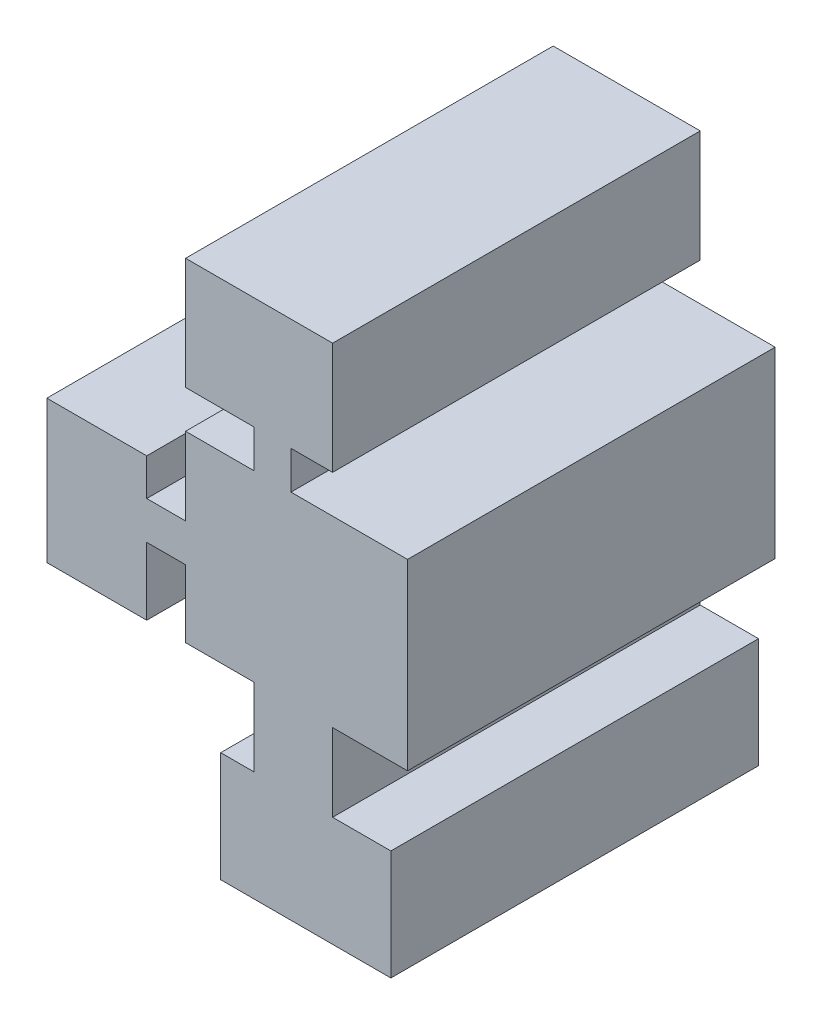
ISO-10303-21;
HEADER;
FILE_DESCRIPTION(('STEP AP214'),'2;1');
FILE_NAME('part.step','',(''),(''),'','','');
FILE_SCHEMA(('AUTOMOTIVE_DESIGN { 1 0 10303 214 1 1 1 1 }'));
ENDSEC;
DATA;
#1=APPLICATION_CONTEXT('core data for automotive mechanical design processes');
#2=APPLICATION_PROTOCOL_DEFINITION('international standard','automotive_design',2000,#1);
#3=PRODUCT_CONTEXT('',#1,'mechanical');
#4=PRODUCT('Part','Part','',(#3));
#5=PRODUCT_RELATED_PRODUCT_CATEGORY('part','',(#4));
#6=PRODUCT_DEFINITION_FORMATION('','',#4);
#7=PRODUCT_DEFINITION_CONTEXT('part definition',#1,'design');
#8=PRODUCT_DEFINITION('design','',#6,#7);
#9=PRODUCT_DEFINITION_SHAPE('','',#8);
#10=(LENGTH_UNIT() NAMED_UNIT(*) SI_UNIT(.MILLI.,.METRE.));
#11=(NAMED_UNIT(*) PLANE_ANGLE_UNIT() SI_UNIT($,.RADIAN.));
#12=(NAMED_UNIT(*) SI_UNIT($,.STERADIAN.) SOLID_ANGLE_UNIT());
#13=UNCERTAINTY_MEASURE_WITH_UNIT(LENGTH_MEASURE(1.E-05),#10,'distance_accuracy_value','');
#14=(GEOMETRIC_REPRESENTATION_CONTEXT(3) GLOBAL_UNCERTAINTY_ASSIGNED_CONTEXT((#13)) GLOBAL_UNIT_ASSIGNED_CONTEXT((#10,
#11,#12)) REPRESENTATION_CONTEXT('',''));
#15=CARTESIAN_POINT('',(0.,0.,0.));
#16=DIRECTION('',(0.,0.,1.));
#17=DIRECTION('',(1.,0.,0.));
#18=AXIS2_PLACEMENT_3D('',#15,#16,#17);
#19=CARTESIAN_POINT('',(539.921047334545,88.9758944559464,10.));
#20=DIRECTION('',(0.,-1.,0.));
#21=DIRECTION('',(0.,0.,-1.));
#22=AXIS2_PLACEMENT_3D('',#19,#20,#21);
#23=PLANE('',#22);
#24=DIRECTION('',(-1.,0.,0.));
#25=VECTOR('',#24,1.);
#26=CARTESIAN_POINT('',(539.921047334545,88.9758944559464,0.));
#27=LINE('',#26,#25);
#28=CARTESIAN_POINT('',(543.0906331024,88.9758944559464,0.));
#29=VERTEX_POINT('',#28);
#30=CARTESIAN_POINT('',(539.921047334545,88.9758944559464,0.));
#31=VERTEX_POINT('',#30);
#32=EDGE_CURVE('E266',#29,#31,#27,.T.);
#33=ORIENTED_EDGE('',*,*,#32,.T.);
#34=DIRECTION('',(0.,0.,-1.));
#35=VECTOR('',#34,1.);
#36=CARTESIAN_POINT('',(539.921047334545,88.9758944559464,10.));
#37=LINE('',#36,#35);
#38=CARTESIAN_POINT('',(539.921047334545,88.9758944559464,10.));
#39=VERTEX_POINT('',#38);
#40=EDGE_CURVE('E11',#39,#31,#37,.T.);
#41=ORIENTED_EDGE('',*,*,#40,.F.);
#42=DIRECTION('',(-1.,0.,0.));
#43=VECTOR('',#42,1.);
#44=CARTESIAN_POINT('',(539.921047334545,88.9758944559464,10.));
#45=LINE('',#44,#43);
#46=CARTESIAN_POINT('',(543.0906331024,88.9758944559464,10.));
#47=VERTEX_POINT('',#46);
#48=EDGE_CURVE('E348',#47,#39,#45,.T.);
#49=ORIENTED_EDGE('',*,*,#48,.F.);
#50=DIRECTION('',(0.,0.,-1.));
#51=VECTOR('',#50,1.);
#52=CARTESIAN_POINT('',(543.0906331024,88.9758944559464,10.));
#53=LINE('',#52,#51);
#54=EDGE_CURVE('E262',#47,#29,#53,.T.);
#55=ORIENTED_EDGE('',*,*,#54,.T.);
#56=EDGE_LOOP('',(#33,#41,#49,#55));
#57=FACE_BOUND('',#56,.T.);
#58=ADVANCED_FACE('F45',(#57),#23,.F.);
#59=CARTESIAN_POINT('',(539.921047334545,90.0072676026294,10.));
#60=DIRECTION('',(-1.,0.,0.));
#61=DIRECTION('',(0.,0.,1.));
#62=AXIS2_PLACEMENT_3D('',#59,#60,#61);
#63=PLANE('',#62);
#64=DIRECTION('',(0.,1.,0.));
#65=VECTOR('',#64,1.);
#66=CARTESIAN_POINT('',(539.921047334545,90.0072676026294,0.));
#67=LINE('',#66,#65);
#68=CARTESIAN_POINT('',(539.921047334545,90.0072676026294,0.));
#69=VERTEX_POINT('',#68);
#70=EDGE_CURVE('E270',#31,#69,#67,.T.);
#71=ORIENTED_EDGE('',*,*,#70,.T.);
#72=DIRECTION('',(0.,0.,-1.));
#73=VECTOR('',#72,1.);
#74=CARTESIAN_POINT('',(539.921047334545,90.0072676026294,10.));
#75=LINE('',#74,#73);
#76=CARTESIAN_POINT('',(539.921047334545,90.0072676026294,10.));
#77=VERTEX_POINT('',#76);
#78=EDGE_CURVE('E54',#77,#69,#75,.T.);
#79=ORIENTED_EDGE('',*,*,#78,.F.);
#80=DIRECTION('',(0.,1.,0.));
#81=VECTOR('',#80,1.);
#82=CARTESIAN_POINT('',(539.921047334545,90.0072676026294,10.));
#83=LINE('',#82,#81);
#84=EDGE_CURVE('E165',#39,#77,#83,.T.);
#85=ORIENTED_EDGE('',*,*,#84,.F.);
#86=ORIENTED_EDGE('',*,*,#40,.T.);
#87=EDGE_LOOP('',(#71,#79,#85,#86));
#88=FACE_BOUND('',#87,.T.);
#89=ADVANCED_FACE('F554',(#88),#63,.F.);
#90=CARTESIAN_POINT('',(541.053042251636,90.0072676026294,10.));
#91=DIRECTION('',(0.,1.,0.));
#92=DIRECTION('',(0.,0.,1.));
#93=AXIS2_PLACEMENT_3D('',#90,#91,#92);
#94=PLANE('',#93);
#95=DIRECTION('',(1.,0.,0.));
#96=VECTOR('',#95,1.);
#97=CARTESIAN_POINT('',(541.053042251636,90.0072676026294,0.));
#98=LINE('',#97,#96);
#99=CARTESIAN_POINT('',(541.053042251636,90.0072676026294,0.));
#100=VERTEX_POINT('',#99);
#101=EDGE_CURVE('E273',#69,#100,#98,.T.);
#102=ORIENTED_EDGE('',*,*,#101,.T.);
#103=DIRECTION('',(0.,0.,-1.));
#104=VECTOR('',#103,1.);
#105=CARTESIAN_POINT('',(541.053042251636,90.0072676026294,10.));
#106=LINE('',#105,#104);
#107=CARTESIAN_POINT('',(541.053042251636,90.0072676026294,10.));
#108=VERTEX_POINT('',#107);
#109=EDGE_CURVE('E439',#108,#100,#106,.T.);
#110=ORIENTED_EDGE('',*,*,#109,.F.);
#111=DIRECTION('',(1.,0.,0.));
#112=VECTOR('',#111,1.);
#113=CARTESIAN_POINT('',(541.053042251636,90.0072676026294,10.));
#114=LINE('',#113,#112);
#115=EDGE_CURVE('E449',#77,#108,#114,.T.);
#116=ORIENTED_EDGE('',*,*,#115,.F.);
#117=ORIENTED_EDGE('',*,*,#78,.T.);
#118=EDGE_LOOP('',(#102,#110,#116,#117));
#119=FACE_BOUND('',#118,.T.);
#120=ADVANCED_FACE('F447',(#119),#94,.F.);
#121=CARTESIAN_POINT('',(541.053042251636,93.0510761574742,10.));
#122=DIRECTION('',(-1.,0.,0.));
#123=DIRECTION('',(0.,0.,1.));
#124=AXIS2_PLACEMENT_3D('',#121,#122,#123);
#125=PLANE('',#124);
#126=DIRECTION('',(0.,1.,0.));
#127=VECTOR('',#126,1.);
#128=CARTESIAN_POINT('',(541.053042251636,93.0510761574742,0.));
#129=LINE('',#128,#127);
#130=CARTESIAN_POINT('',(541.053042251636,93.0510761574742,0.));
#131=VERTEX_POINT('',#130);
#132=EDGE_CURVE('E276',#100,#131,#129,.T.);
#133=ORIENTED_EDGE('',*,*,#132,.T.);
#134=DIRECTION('',(0.,0.,-1.));
#135=VECTOR('',#134,1.);
#136=CARTESIAN_POINT('',(541.053042251636,93.0510761574742,10.));
#137=LINE('',#136,#135);
#138=CARTESIAN_POINT('',(541.053042251636,93.0510761574742,10.));
#139=VERTEX_POINT('',#138);
#140=EDGE_CURVE('E435',#139,#131,#137,.T.);
#141=ORIENTED_EDGE('',*,*,#140,.F.);
#142=DIRECTION('',(0.,1.,0.));
#143=VECTOR('',#142,1.);
#144=CARTESIAN_POINT('',(541.053042251636,93.0510761574742,10.));
#145=LINE('',#144,#143);
#146=EDGE_CURVE('E468',#108,#139,#145,.T.);
#147=ORIENTED_EDGE('',*,*,#146,.F.);
#148=ORIENTED_EDGE('',*,*,#109,.T.);
#149=EDGE_LOOP('',(#133,#141,#147,#148));
#150=FACE_BOUND('',#149,.T.);
#151=ADVANCED_FACE('F458',(#150),#125,.F.);
#152=CARTESIAN_POINT('',(537.053326877914,93.0510761574742,10.));
#153=DIRECTION('',(0.,-1.,0.));
#154=DIRECTION('',(0.,0.,-1.));
#155=AXIS2_PLACEMENT_3D('',#152,#153,#154);
#156=PLANE('',#155);
#157=DIRECTION('',(-1.,0.,0.));
#158=VECTOR('',#157,1.);
#159=CARTESIAN_POINT('',(537.053326877914,93.0510761574742,0.));
#160=LINE('',#159,#158);
#161=CARTESIAN_POINT('',(537.053326877914,93.0510761574742,0.));
#162=VERTEX_POINT('',#161);
#163=EDGE_CURVE('E279',#131,#162,#160,.T.);
#164=ORIENTED_EDGE('',*,*,#163,.T.);
#165=DIRECTION('',(0.,0.,-1.));
#166=VECTOR('',#165,1.);
#167=CARTESIAN_POINT('',(537.053326877914,93.0510761574742,10.));
#168=LINE('',#167,#166);
#169=CARTESIAN_POINT('',(537.053326877914,93.0510761574742,10.));
#170=VERTEX_POINT('',#169);
#171=EDGE_CURVE('E431',#170,#162,#168,.T.);
#172=ORIENTED_EDGE('',*,*,#171,.F.);
#173=DIRECTION('',(-1.,0.,0.));
#174=VECTOR('',#173,1.);
#175=CARTESIAN_POINT('',(537.053326877914,93.0510761574742,10.));
#176=LINE('',#175,#174);
#177=EDGE_CURVE('E464',#139,#170,#176,.T.);
#178=ORIENTED_EDGE('',*,*,#177,.F.);
#179=ORIENTED_EDGE('',*,*,#140,.T.);
#180=EDGE_LOOP('',(#164,#172,#178,#179));
#181=FACE_BOUND('',#180,.T.);
#182=ADVANCED_FACE('F462',(#181),#156,.F.);
#183=CARTESIAN_POINT('',(537.053326877914,90.0072676026294,10.));
#184=DIRECTION('',(1.,0.,0.));
#185=DIRECTION('',(0.,0.,-1.));
#186=AXIS2_PLACEMENT_3D('',#183,#184,#185);
#187=PLANE('',#186);
#188=DIRECTION('',(0.,-1.,0.));
#189=VECTOR('',#188,1.);
#190=CARTESIAN_POINT('',(537.053326877914,90.0072676026294,0.));
#191=LINE('',#190,#189);
#192=CARTESIAN_POINT('',(537.053326877914,90.0072676026294,0.));
#193=VERTEX_POINT('',#192);
#194=EDGE_CURVE('E282',#162,#193,#191,.T.);
#195=ORIENTED_EDGE('',*,*,#194,.T.);
#196=DIRECTION('',(0.,0.,-1.));
#197=VECTOR('',#196,1.);
#198=CARTESIAN_POINT('',(537.053326877914,90.0072676026294,10.));
#199=LINE('',#198,#197);
#200=CARTESIAN_POINT('',(537.053326877914,90.0072676026294,10.));
#201=VERTEX_POINT('',#200);
#202=EDGE_CURVE('E427',#201,#193,#199,.T.);
#203=ORIENTED_EDGE('',*,*,#202,.F.);
#204=DIRECTION('',(0.,-1.,0.));
#205=VECTOR('',#204,1.);
#206=CARTESIAN_POINT('',(537.053326877914,90.0072676026294,10.));
#207=LINE('',#206,#205);
#208=EDGE_CURVE('E467',#170,#201,#207,.T.);
#209=ORIENTED_EDGE('',*,*,#208,.F.);
#210=ORIENTED_EDGE('',*,*,#171,.T.);
#211=EDGE_LOOP('',(#195,#203,#209,#210));
#212=FACE_BOUND('',#211,.T.);
#213=ADVANCED_FACE('F567',(#212),#187,.F.);
#214=CARTESIAN_POINT('',(538.914829630464,90.0072676026294,10.));
#215=DIRECTION('',(0.,1.,0.));
#216=DIRECTION('',(0.,0.,1.));
#217=AXIS2_PLACEMENT_3D('',#214,#215,#216);
#218=PLANE('',#217);
#219=DIRECTION('',(1.,0.,0.));
#220=VECTOR('',#219,1.);
#221=CARTESIAN_POINT('',(538.914829630464,90.0072676026294,0.));
#222=LINE('',#221,#220);
#223=CARTESIAN_POINT('',(538.914829630464,90.0072676026294,0.));
#224=VERTEX_POINT('',#223);
#225=EDGE_CURVE('E285',#193,#224,#222,.T.);
#226=ORIENTED_EDGE('',*,*,#225,.T.);
#227=DIRECTION('',(0.,0.,-1.));
#228=VECTOR('',#227,1.);
#229=CARTESIAN_POINT('',(538.914829630464,90.0072676026294,10.));
#230=LINE('',#229,#228);
#231=CARTESIAN_POINT('',(538.914829630464,90.0072676026294,10.));
#232=VERTEX_POINT('',#231);
#233=EDGE_CURVE('E423',#232,#224,#230,.T.);
#234=ORIENTED_EDGE('',*,*,#233,.F.);
#235=DIRECTION('',(1.,0.,0.));
#236=VECTOR('',#235,1.);
#237=CARTESIAN_POINT('',(538.914829630464,90.0072676026294,10.));
#238=LINE('',#237,#236);
#239=EDGE_CURVE('E472',#201,#232,#238,.T.);
#240=ORIENTED_EDGE('',*,*,#239,.F.);
#241=ORIENTED_EDGE('',*,*,#202,.T.);
#242=EDGE_LOOP('',(#226,#234,#240,#241));
#243=FACE_BOUND('',#242,.T.);
#244=ADVANCED_FACE('F570',(#243),#218,.F.);
#245=CARTESIAN_POINT('',(538.914829630464,88.9758944559464,10.));
#246=DIRECTION('',(1.,0.,0.));
#247=DIRECTION('',(0.,0.,-1.));
#248=AXIS2_PLACEMENT_3D('',#245,#246,#247);
#249=PLANE('',#248);
#250=DIRECTION('',(0.,-1.,0.));
#251=VECTOR('',#250,1.);
#252=CARTESIAN_POINT('',(538.914829630464,88.9758944559464,0.));
#253=LINE('',#252,#251);
#254=CARTESIAN_POINT('',(538.914829630464,88.9758944559464,0.));
#255=VERTEX_POINT('',#254);
#256=EDGE_CURVE('E288',#224,#255,#253,.T.);
#257=ORIENTED_EDGE('',*,*,#256,.T.);
#258=DIRECTION('',(0.,0.,-1.));
#259=VECTOR('',#258,1.);
#260=CARTESIAN_POINT('',(538.914829630464,88.9758944559464,10.));
#261=LINE('',#260,#259);
#262=CARTESIAN_POINT('',(538.914829630464,88.9758944559464,10.));
#263=VERTEX_POINT('',#262);
#264=EDGE_CURVE('E419',#263,#255,#261,.T.);
#265=ORIENTED_EDGE('',*,*,#264,.F.);
#266=DIRECTION('',(0.,-1.,0.));
#267=VECTOR('',#266,1.);
#268=CARTESIAN_POINT('',(538.914829630464,88.9758944559464,10.));
#269=LINE('',#268,#267);
#270=EDGE_CURVE('E479',#232,#263,#269,.T.);
#271=ORIENTED_EDGE('',*,*,#270,.F.);
#272=ORIENTED_EDGE('',*,*,#233,.T.);
#273=EDGE_LOOP('',(#257,#265,#271,#272));
#274=FACE_BOUND('',#273,.T.);
#275=ADVANCED_FACE('F574',(#274),#249,.F.);
#276=CARTESIAN_POINT('',(537.053326877914,88.9758944559464,10.));
#277=DIRECTION('',(0.,-1.,0.));
#278=DIRECTION('',(0.,0.,-1.));
#279=AXIS2_PLACEMENT_3D('',#276,#277,#278);
#280=PLANE('',#279);
#281=DIRECTION('',(-1.,0.,0.));
#282=VECTOR('',#281,1.);
#283=CARTESIAN_POINT('',(537.053326877914,88.9758944559464,0.));
#284=LINE('',#283,#282);
#285=CARTESIAN_POINT('',(537.053326877914,88.9758944559464,0.));
#286=VERTEX_POINT('',#285);
#287=EDGE_CURVE('E291',#255,#286,#284,.T.);
#288=ORIENTED_EDGE('',*,*,#287,.T.);
#289=DIRECTION('',(0.,0.,-1.));
#290=VECTOR('',#289,1.);
#291=CARTESIAN_POINT('',(537.053326877914,88.9758944559464,10.));
#292=LINE('',#291,#290);
#293=CARTESIAN_POINT('',(537.053326877914,88.9758944559464,10.));
#294=VERTEX_POINT('',#293);
#295=EDGE_CURVE('E415',#294,#286,#292,.T.);
#296=ORIENTED_EDGE('',*,*,#295,.F.);
#297=DIRECTION('',(-1.,0.,0.));
#298=VECTOR('',#297,1.);
#299=CARTESIAN_POINT('',(537.053326877914,88.9758944559464,10.));
#300=LINE('',#299,#298);
#301=EDGE_CURVE('E482',#263,#294,#300,.T.);
#302=ORIENTED_EDGE('',*,*,#301,.F.);
#303=ORIENTED_EDGE('',*,*,#264,.T.);
#304=EDGE_LOOP('',(#288,#296,#302,#303));
#305=FACE_BOUND('',#304,.T.);
#306=ADVANCED_FACE('F578',(#305),#280,.F.);
#307=CARTESIAN_POINT('',(537.053326877914,86.8628372773765,10.));
#308=DIRECTION('',(1.,0.,0.));
#309=DIRECTION('',(0.,0.,-1.));
#310=AXIS2_PLACEMENT_3D('',#307,#308,#309);
#311=PLANE('',#310);
#312=DIRECTION('',(0.,-1.,0.));
#313=VECTOR('',#312,1.);
#314=CARTESIAN_POINT('',(537.053326877914,86.8628372773765,0.));
#315=LINE('',#314,#313);
#316=CARTESIAN_POINT('',(537.053326877914,86.8628372773765,0.));
#317=VERTEX_POINT('',#316);
#318=EDGE_CURVE('E294',#286,#317,#315,.T.);
#319=ORIENTED_EDGE('',*,*,#318,.T.);
#320=DIRECTION('',(0.,0.,-1.));
#321=VECTOR('',#320,1.);
#322=CARTESIAN_POINT('',(537.053326877914,86.8628372773765,10.));
#323=LINE('',#322,#321);
#324=CARTESIAN_POINT('',(537.053326877914,86.8628372773765,10.));
#325=VERTEX_POINT('',#324);
#326=EDGE_CURVE('E411',#325,#317,#323,.T.);
#327=ORIENTED_EDGE('',*,*,#326,.F.);
#328=DIRECTION('',(0.,-1.,0.));
#329=VECTOR('',#328,1.);
#330=CARTESIAN_POINT('',(537.053326877914,86.8628372773765,10.));
#331=LINE('',#330,#329);
#332=EDGE_CURVE('E485',#294,#325,#331,.T.);
#333=ORIENTED_EDGE('',*,*,#332,.F.);
#334=ORIENTED_EDGE('',*,*,#295,.T.);
#335=EDGE_LOOP('',(#319,#327,#333,#334));
#336=FACE_BOUND('',#335,.T.);
#337=ADVANCED_FACE('F582',(#336),#311,.F.);
#338=CARTESIAN_POINT('',(535.996798288629,86.8628372773765,10.));
#339=DIRECTION('',(0.,-1.,0.));
#340=DIRECTION('',(0.,0.,-1.));
#341=AXIS2_PLACEMENT_3D('',#338,#339,#340);
#342=PLANE('',#341);
#343=DIRECTION('',(-1.,0.,0.));
#344=VECTOR('',#343,1.);
#345=CARTESIAN_POINT('',(535.996798288629,86.8628372773765,0.));
#346=LINE('',#345,#344);
#347=CARTESIAN_POINT('',(535.996798288629,86.8628372773765,0.));
#348=VERTEX_POINT('',#347);
#349=EDGE_CURVE('E297',#317,#348,#346,.T.);
#350=ORIENTED_EDGE('',*,*,#349,.T.);
#351=DIRECTION('',(0.,0.,-1.));
#352=VECTOR('',#351,1.);
#353=CARTESIAN_POINT('',(535.996798288629,86.8628372773765,10.));
#354=LINE('',#353,#352);
#355=CARTESIAN_POINT('',(535.996798288629,86.8628372773765,10.));
#356=VERTEX_POINT('',#355);
#357=EDGE_CURVE('E407',#356,#348,#354,.T.);
#358=ORIENTED_EDGE('',*,*,#357,.F.);
#359=DIRECTION('',(-1.,0.,0.));
#360=VECTOR('',#359,1.);
#361=CARTESIAN_POINT('',(535.996798288629,86.8628372773765,10.));
#362=LINE('',#361,#360);
#363=EDGE_CURVE('E488',#325,#356,#362,.T.);
#364=ORIENTED_EDGE('',*,*,#363,.F.);
#365=ORIENTED_EDGE('',*,*,#326,.T.);
#366=EDGE_LOOP('',(#350,#358,#364,#365));
#367=FACE_BOUND('',#366,.T.);
#368=ADVANCED_FACE('F586',(#367),#342,.F.);
#369=CARTESIAN_POINT('',(535.996798288629,87.8690549814574,10.));
#370=DIRECTION('',(-1.,0.,0.));
#371=DIRECTION('',(0.,0.,1.));
#372=AXIS2_PLACEMENT_3D('',#369,#370,#371);
#373=PLANE('',#372);
#374=DIRECTION('',(0.,1.,0.));
#375=VECTOR('',#374,1.);
#376=CARTESIAN_POINT('',(535.996798288629,87.8690549814574,0.));
#377=LINE('',#376,#375);
#378=CARTESIAN_POINT('',(535.996798288629,87.8690549814574,0.));
#379=VERTEX_POINT('',#378);
#380=EDGE_CURVE('E300',#348,#379,#377,.T.);
#381=ORIENTED_EDGE('',*,*,#380,.T.);
#382=DIRECTION('',(0.,0.,-1.));
#383=VECTOR('',#382,1.);
#384=CARTESIAN_POINT('',(535.996798288629,87.8690549814574,10.));
#385=LINE('',#384,#383);
#386=CARTESIAN_POINT('',(535.996798288629,87.8690549814574,10.));
#387=VERTEX_POINT('',#386);
#388=EDGE_CURVE('E403',#387,#379,#385,.T.);
#389=ORIENTED_EDGE('',*,*,#388,.F.);
#390=DIRECTION('',(0.,1.,0.));
#391=VECTOR('',#390,1.);
#392=CARTESIAN_POINT('',(535.996798288629,87.8690549814574,10.));
#393=LINE('',#392,#391);
#394=EDGE_CURVE('E491',#356,#387,#393,.T.);
#395=ORIENTED_EDGE('',*,*,#394,.F.);
#396=ORIENTED_EDGE('',*,*,#357,.T.);
#397=EDGE_LOOP('',(#381,#389,#395,#396));
#398=FACE_BOUND('',#397,.T.);
#399=ADVANCED_FACE('F590',(#398),#373,.F.);
#400=CARTESIAN_POINT('',(533.280010487611,87.8690549814574,10.));
#401=DIRECTION('',(0.,-1.,0.));
#402=DIRECTION('',(0.,0.,-1.));
#403=AXIS2_PLACEMENT_3D('',#400,#401,#402);
#404=PLANE('',#403);
#405=DIRECTION('',(-1.,0.,0.));
#406=VECTOR('',#405,1.);
#407=CARTESIAN_POINT('',(533.280010487611,87.8690549814574,0.));
#408=LINE('',#407,#406);
#409=CARTESIAN_POINT('',(533.280010487611,87.8690549814574,0.));
#410=VERTEX_POINT('',#409);
#411=EDGE_CURVE('E303',#379,#410,#408,.T.);
#412=ORIENTED_EDGE('',*,*,#411,.T.);
#413=DIRECTION('',(0.,0.,-1.));
#414=VECTOR('',#413,1.);
#415=CARTESIAN_POINT('',(533.280010487611,87.8690549814574,10.));
#416=LINE('',#415,#414);
#417=CARTESIAN_POINT('',(533.280010487611,87.8690549814574,10.));
#418=VERTEX_POINT('',#417);
#419=EDGE_CURVE('E399',#418,#410,#416,.T.);
#420=ORIENTED_EDGE('',*,*,#419,.F.);
#421=DIRECTION('',(-1.,0.,0.));
#422=VECTOR('',#421,1.);
#423=CARTESIAN_POINT('',(533.280010487611,87.8690549814574,10.));
#424=LINE('',#423,#422);
#425=EDGE_CURVE('E494',#387,#418,#424,.T.);
#426=ORIENTED_EDGE('',*,*,#425,.F.);
#427=ORIENTED_EDGE('',*,*,#388,.T.);
#428=EDGE_LOOP('',(#412,#420,#426,#427));
#429=FACE_BOUND('',#428,.T.);
#430=ADVANCED_FACE('F594',(#429),#404,.F.);
#431=CARTESIAN_POINT('',(533.280010487611,83.9951168207459,10.));
#432=DIRECTION('',(1.,0.,0.));
#433=DIRECTION('',(0.,0.,-1.));
#434=AXIS2_PLACEMENT_3D('',#431,#432,#433);
#435=PLANE('',#434);
#436=DIRECTION('',(0.,-1.,0.));
#437=VECTOR('',#436,1.);
#438=CARTESIAN_POINT('',(533.280010487611,83.9951168207459,0.));
#439=LINE('',#438,#437);
#440=CARTESIAN_POINT('',(533.280010487611,83.9951168207459,0.));
#441=VERTEX_POINT('',#440);
#442=EDGE_CURVE('E306',#410,#441,#439,.T.);
#443=ORIENTED_EDGE('',*,*,#442,.T.);
#444=DIRECTION('',(0.,0.,-1.));
#445=VECTOR('',#444,1.);
#446=CARTESIAN_POINT('',(533.280010487611,83.9951168207459,10.));
#447=LINE('',#446,#445);
#448=CARTESIAN_POINT('',(533.280010487611,83.9951168207459,10.));
#449=VERTEX_POINT('',#448);
#450=EDGE_CURVE('E395',#449,#441,#447,.T.);
#451=ORIENTED_EDGE('',*,*,#450,.F.);
#452=DIRECTION('',(0.,-1.,0.));
#453=VECTOR('',#452,1.);
#454=CARTESIAN_POINT('',(533.280010487611,83.9951168207459,10.));
#455=LINE('',#454,#453);
#456=EDGE_CURVE('E497',#418,#449,#455,.T.);
#457=ORIENTED_EDGE('',*,*,#456,.F.);
#458=ORIENTED_EDGE('',*,*,#419,.T.);
#459=EDGE_LOOP('',(#443,#451,#457,#458));
#460=FACE_BOUND('',#459,.T.);
#461=ADVANCED_FACE('F598',(#460),#435,.F.);
#462=CARTESIAN_POINT('',(535.996798288629,83.9951168207459,10.));
#463=DIRECTION('',(0.,1.,0.));
#464=DIRECTION('',(0.,0.,1.));
#465=AXIS2_PLACEMENT_3D('',#462,#463,#464);
#466=PLANE('',#465);
#467=DIRECTION('',(1.,0.,0.));
#468=VECTOR('',#467,1.);
#469=CARTESIAN_POINT('',(535.996798288629,83.9951168207459,0.));
#470=LINE('',#469,#468);
#471=CARTESIAN_POINT('',(535.996798288629,83.9951168207459,0.));
#472=VERTEX_POINT('',#471);
#473=EDGE_CURVE('E309',#441,#472,#470,.T.);
#474=ORIENTED_EDGE('',*,*,#473,.T.);
#475=DIRECTION('',(0.,0.,-1.));
#476=VECTOR('',#475,1.);
#477=CARTESIAN_POINT('',(535.996798288629,83.9951168207459,10.));
#478=LINE('',#477,#476);
#479=CARTESIAN_POINT('',(535.996798288629,83.9951168207459,10.));
#480=VERTEX_POINT('',#479);
#481=EDGE_CURVE('E391',#480,#472,#478,.T.);
#482=ORIENTED_EDGE('',*,*,#481,.F.);
#483=DIRECTION('',(1.,0.,0.));
#484=VECTOR('',#483,1.);
#485=CARTESIAN_POINT('',(535.996798288629,83.9951168207459,10.));
#486=LINE('',#485,#484);
#487=EDGE_CURVE('E500',#449,#480,#486,.T.);
#488=ORIENTED_EDGE('',*,*,#487,.F.);
#489=ORIENTED_EDGE('',*,*,#450,.T.);
#490=EDGE_LOOP('',(#474,#482,#488,#489));
#491=FACE_BOUND('',#490,.T.);
#492=ADVANCED_FACE('F602',(#491),#466,.F.);
#493=CARTESIAN_POINT('',(535.996798288629,85.8314641306935,10.));
#494=DIRECTION('',(-1.,0.,0.));
#495=DIRECTION('',(0.,0.,1.));
#496=AXIS2_PLACEMENT_3D('',#493,#494,#495);
#497=PLANE('',#496);
#498=DIRECTION('',(0.,1.,0.));
#499=VECTOR('',#498,1.);
#500=CARTESIAN_POINT('',(535.996798288629,85.8314641306935,0.));
#501=LINE('',#500,#499);
#502=CARTESIAN_POINT('',(535.996798288629,85.8314641306935,0.));
#503=VERTEX_POINT('',#502);
#504=EDGE_CURVE('E312',#472,#503,#501,.T.);
#505=ORIENTED_EDGE('',*,*,#504,.T.);
#506=DIRECTION('',(0.,0.,-1.));
#507=VECTOR('',#506,1.);
#508=CARTESIAN_POINT('',(535.996798288629,85.8314641306935,10.));
#509=LINE('',#508,#507);
#510=CARTESIAN_POINT('',(535.996798288629,85.8314641306935,10.));
#511=VERTEX_POINT('',#510);
#512=EDGE_CURVE('E387',#511,#503,#509,.T.);
#513=ORIENTED_EDGE('',*,*,#512,.F.);
#514=DIRECTION('',(0.,1.,0.));
#515=VECTOR('',#514,1.);
#516=CARTESIAN_POINT('',(535.996798288629,85.8314641306935,10.));
#517=LINE('',#516,#515);
#518=EDGE_CURVE('E503',#480,#511,#517,.T.);
#519=ORIENTED_EDGE('',*,*,#518,.F.);
#520=ORIENTED_EDGE('',*,*,#481,.T.);
#521=EDGE_LOOP('',(#505,#513,#519,#520));
#522=FACE_BOUND('',#521,.T.);
#523=ADVANCED_FACE('F606',(#522),#497,.F.);
#524=CARTESIAN_POINT('',(537.053326877914,85.8314641306935,10.));
#525=DIRECTION('',(0.,1.,0.));
#526=DIRECTION('',(0.,0.,1.));
#527=AXIS2_PLACEMENT_3D('',#524,#525,#526);
#528=PLANE('',#527);
#529=DIRECTION('',(1.,0.,0.));
#530=VECTOR('',#529,1.);
#531=CARTESIAN_POINT('',(537.053326877914,85.8314641306935,0.));
#532=LINE('',#531,#530);
#533=CARTESIAN_POINT('',(537.053326877914,85.8314641306935,0.));
#534=VERTEX_POINT('',#533);
#535=EDGE_CURVE('E315',#503,#534,#532,.T.);
#536=ORIENTED_EDGE('',*,*,#535,.T.);
#537=DIRECTION('',(0.,0.,-1.));
#538=VECTOR('',#537,1.);
#539=CARTESIAN_POINT('',(537.053326877914,85.8314641306935,10.));
#540=LINE('',#539,#538);
#541=CARTESIAN_POINT('',(537.053326877914,85.8314641306935,10.));
#542=VERTEX_POINT('',#541);
#543=EDGE_CURVE('E383',#542,#534,#540,.T.);
#544=ORIENTED_EDGE('',*,*,#543,.F.);
#545=DIRECTION('',(1.,0.,0.));
#546=VECTOR('',#545,1.);
#547=CARTESIAN_POINT('',(537.053326877914,85.8314641306935,10.));
#548=LINE('',#547,#546);
#549=EDGE_CURVE('E506',#511,#542,#548,.T.);
#550=ORIENTED_EDGE('',*,*,#549,.F.);
#551=ORIENTED_EDGE('',*,*,#512,.T.);
#552=EDGE_LOOP('',(#536,#544,#550,#551));
#553=FACE_BOUND('',#552,.T.);
#554=ADVANCED_FACE('F610',(#553),#528,.F.);
#555=CARTESIAN_POINT('',(537.053326877914,83.9951168207459,10.));
#556=DIRECTION('',(1.,0.,0.));
#557=DIRECTION('',(0.,0.,-1.));
#558=AXIS2_PLACEMENT_3D('',#555,#556,#557);
#559=PLANE('',#558);
#560=DIRECTION('',(0.,-1.,0.));
#561=VECTOR('',#560,1.);
#562=CARTESIAN_POINT('',(537.053326877914,83.9951168207459,0.));
#563=LINE('',#562,#561);
#564=CARTESIAN_POINT('',(537.053326877914,83.9951168207459,0.));
#565=VERTEX_POINT('',#564);
#566=EDGE_CURVE('E318',#534,#565,#563,.T.);
#567=ORIENTED_EDGE('',*,*,#566,.T.);
#568=DIRECTION('',(0.,0.,-1.));
#569=VECTOR('',#568,1.);
#570=CARTESIAN_POINT('',(537.053326877914,83.9951168207459,10.));
#571=LINE('',#570,#569);
#572=CARTESIAN_POINT('',(537.053326877914,83.9951168207459,10.));
#573=VERTEX_POINT('',#572);
#574=EDGE_CURVE('E379',#573,#565,#571,.T.);
#575=ORIENTED_EDGE('',*,*,#574,.F.);
#576=DIRECTION('',(0.,-1.,0.));
#577=VECTOR('',#576,1.);
#578=CARTESIAN_POINT('',(537.053326877914,83.9951168207459,10.));
#579=LINE('',#578,#577);
#580=EDGE_CURVE('E509',#542,#573,#579,.T.);
#581=ORIENTED_EDGE('',*,*,#580,.F.);
#582=ORIENTED_EDGE('',*,*,#543,.T.);
#583=EDGE_LOOP('',(#567,#575,#581,#582));
#584=FACE_BOUND('',#583,.T.);
#585=ADVANCED_FACE('F614',(#584),#559,.F.);
#586=CARTESIAN_POINT('',(538.914829630464,83.9951168207459,10.));
#587=DIRECTION('',(0.,1.,0.));
#588=DIRECTION('',(0.,0.,1.));
#589=AXIS2_PLACEMENT_3D('',#586,#587,#588);
#590=PLANE('',#589);
#591=DIRECTION('',(1.,0.,0.));
#592=VECTOR('',#591,1.);
#593=CARTESIAN_POINT('',(538.914829630464,83.9951168207459,0.));
#594=LINE('',#593,#592);
#595=CARTESIAN_POINT('',(538.914829630464,83.9951168207459,0.));
#596=VERTEX_POINT('',#595);
#597=EDGE_CURVE('E321',#565,#596,#594,.T.);
#598=ORIENTED_EDGE('',*,*,#597,.T.);
#599=DIRECTION('',(0.,0.,-1.));
#600=VECTOR('',#599,1.);
#601=CARTESIAN_POINT('',(538.914829630464,83.9951168207459,10.));
#602=LINE('',#601,#600);
#603=CARTESIAN_POINT('',(538.914829630464,83.9951168207459,10.));
#604=VERTEX_POINT('',#603);
#605=EDGE_CURVE('E375',#604,#596,#602,.T.);
#606=ORIENTED_EDGE('',*,*,#605,.F.);
#607=DIRECTION('',(1.,0.,0.));
#608=VECTOR('',#607,1.);
#609=CARTESIAN_POINT('',(538.914829630464,83.9951168207459,10.));
#610=LINE('',#609,#608);
#611=EDGE_CURVE('E512',#573,#604,#610,.T.);
#612=ORIENTED_EDGE('',*,*,#611,.F.);
#613=ORIENTED_EDGE('',*,*,#574,.T.);
#614=EDGE_LOOP('',(#598,#606,#612,#613));
#615=FACE_BOUND('',#614,.T.);
#616=ADVANCED_FACE('F618',(#615),#590,.F.);
#617=CARTESIAN_POINT('',(538.914829630464,81.8820596421759,10.));
#618=DIRECTION('',(1.,0.,0.));
#619=DIRECTION('',(0.,0.,-1.));
#620=AXIS2_PLACEMENT_3D('',#617,#618,#619);
#621=PLANE('',#620);
#622=DIRECTION('',(0.,-1.,0.));
#623=VECTOR('',#622,1.);
#624=CARTESIAN_POINT('',(538.914829630464,81.8820596421759,0.));
#625=LINE('',#624,#623);
#626=CARTESIAN_POINT('',(538.914829630464,81.8820596421759,0.));
#627=VERTEX_POINT('',#626);
#628=EDGE_CURVE('E324',#596,#627,#625,.T.);
#629=ORIENTED_EDGE('',*,*,#628,.T.);
#630=DIRECTION('',(0.,0.,-1.));
#631=VECTOR('',#630,1.);
#632=CARTESIAN_POINT('',(538.914829630464,81.8820596421759,10.));
#633=LINE('',#632,#631);
#634=CARTESIAN_POINT('',(538.914829630464,81.8820596421759,10.));
#635=VERTEX_POINT('',#634);
#636=EDGE_CURVE('E371',#635,#627,#633,.T.);
#637=ORIENTED_EDGE('',*,*,#636,.F.);
#638=DIRECTION('',(0.,-1.,0.));
#639=VECTOR('',#638,1.);
#640=CARTESIAN_POINT('',(538.914829630464,81.8820596421759,10.));
#641=LINE('',#640,#639);
#642=EDGE_CURVE('E515',#604,#635,#641,.T.);
#643=ORIENTED_EDGE('',*,*,#642,.F.);
#644=ORIENTED_EDGE('',*,*,#605,.T.);
#645=EDGE_LOOP('',(#629,#637,#643,#644));
#646=FACE_BOUND('',#645,.T.);
#647=ADVANCED_FACE('F622',(#646),#621,.F.);
#648=CARTESIAN_POINT('',(538.009233696791,81.8820596421759,10.));
#649=DIRECTION('',(0.,-1.,0.));
#650=DIRECTION('',(0.,0.,-1.));
#651=AXIS2_PLACEMENT_3D('',#648,#649,#650);
#652=PLANE('',#651);
#653=DIRECTION('',(-1.,0.,0.));
#654=VECTOR('',#653,1.);
#655=CARTESIAN_POINT('',(538.009233696791,81.8820596421759,0.));
#656=LINE('',#655,#654);
#657=CARTESIAN_POINT('',(538.009233696791,81.8820596421759,0.));
#658=VERTEX_POINT('',#657);
#659=EDGE_CURVE('E327',#627,#658,#656,.T.);
#660=ORIENTED_EDGE('',*,*,#659,.T.);
#661=DIRECTION('',(0.,0.,-1.));
#662=VECTOR('',#661,1.);
#663=CARTESIAN_POINT('',(538.009233696791,81.8820596421759,10.));
#664=LINE('',#663,#662);
#665=CARTESIAN_POINT('',(538.009233696791,81.8820596421759,10.));
#666=VERTEX_POINT('',#665);
#667=EDGE_CURVE('E367',#666,#658,#664,.T.);
#668=ORIENTED_EDGE('',*,*,#667,.F.);
#669=DIRECTION('',(-1.,0.,0.));
#670=VECTOR('',#669,1.);
#671=CARTESIAN_POINT('',(538.009233696791,81.8820596421759,10.));
#672=LINE('',#671,#670);
#673=EDGE_CURVE('E518',#635,#666,#672,.T.);
#674=ORIENTED_EDGE('',*,*,#673,.F.);
#675=ORIENTED_EDGE('',*,*,#636,.T.);
#676=EDGE_LOOP('',(#660,#668,#674,#675));
#677=FACE_BOUND('',#676,.T.);
#678=ADVANCED_FACE('F626',(#677),#652,.F.);
#679=CARTESIAN_POINT('',(538.009233696791,78.8885619725352,10.));
#680=DIRECTION('',(1.,0.,0.));
#681=DIRECTION('',(0.,0.,-1.));
#682=AXIS2_PLACEMENT_3D('',#679,#680,#681);
#683=PLANE('',#682);
#684=DIRECTION('',(0.,-1.,0.));
#685=VECTOR('',#684,1.);
#686=CARTESIAN_POINT('',(538.009233696791,78.8885619725352,0.));
#687=LINE('',#686,#685);
#688=CARTESIAN_POINT('',(538.009233696791,78.8885619725352,0.));
#689=VERTEX_POINT('',#688);
#690=EDGE_CURVE('E330',#658,#689,#687,.T.);
#691=ORIENTED_EDGE('',*,*,#690,.T.);
#692=DIRECTION('',(0.,0.,-1.));
#693=VECTOR('',#692,1.);
#694=CARTESIAN_POINT('',(538.009233696791,78.8885619725352,10.));
#695=LINE('',#694,#693);
#696=CARTESIAN_POINT('',(538.009233696791,78.8885619725352,10.));
#697=VERTEX_POINT('',#696);
#698=EDGE_CURVE('E363',#697,#689,#695,.T.);
#699=ORIENTED_EDGE('',*,*,#698,.F.);
#700=DIRECTION('',(0.,-1.,0.));
#701=VECTOR('',#700,1.);
#702=CARTESIAN_POINT('',(538.009233696791,78.8885619725352,10.));
#703=LINE('',#702,#701);
#704=EDGE_CURVE('E521',#666,#697,#703,.T.);
#705=ORIENTED_EDGE('',*,*,#704,.F.);
#706=ORIENTED_EDGE('',*,*,#667,.T.);
#707=EDGE_LOOP('',(#691,#699,#705,#706));
#708=FACE_BOUND('',#707,.T.);
#709=ADVANCED_FACE('F630',(#708),#683,.F.);
#710=CARTESIAN_POINT('',(542.637835135563,78.8885619725352,10.));
#711=DIRECTION('',(0.,1.,0.));
#712=DIRECTION('',(0.,0.,1.));
#713=AXIS2_PLACEMENT_3D('',#710,#711,#712);
#714=PLANE('',#713);
#715=DIRECTION('',(1.,0.,0.));
#716=VECTOR('',#715,1.);
#717=CARTESIAN_POINT('',(542.637835135563,78.8885619725352,0.));
#718=LINE('',#717,#716);
#719=CARTESIAN_POINT('',(542.637835135563,78.8885619725352,0.));
#720=VERTEX_POINT('',#719);
#721=EDGE_CURVE('E333',#689,#720,#718,.T.);
#722=ORIENTED_EDGE('',*,*,#721,.T.);
#723=DIRECTION('',(0.,0.,-1.));
#724=VECTOR('',#723,1.);
#725=CARTESIAN_POINT('',(542.637835135563,78.8885619725352,10.));
#726=LINE('',#725,#724);
#727=CARTESIAN_POINT('',(542.637835135563,78.8885619725352,10.));
#728=VERTEX_POINT('',#727);
#729=EDGE_CURVE('E359',#728,#720,#726,.T.);
#730=ORIENTED_EDGE('',*,*,#729,.F.);
#731=DIRECTION('',(1.,0.,0.));
#732=VECTOR('',#731,1.);
#733=CARTESIAN_POINT('',(542.637835135563,78.8885619725352,10.));
#734=LINE('',#733,#732);
#735=EDGE_CURVE('E524',#697,#728,#734,.T.);
#736=ORIENTED_EDGE('',*,*,#735,.F.);
#737=ORIENTED_EDGE('',*,*,#698,.T.);
#738=EDGE_LOOP('',(#722,#730,#736,#737));
#739=FACE_BOUND('',#738,.T.);
#740=ADVANCED_FACE('F634',(#739),#714,.F.);
#741=CARTESIAN_POINT('',(542.637835135563,81.8820596421759,10.));
#742=DIRECTION('',(-1.,0.,0.));
#743=DIRECTION('',(0.,0.,1.));
#744=AXIS2_PLACEMENT_3D('',#741,#742,#743);
#745=PLANE('',#744);
#746=DIRECTION('',(0.,1.,0.));
#747=VECTOR('',#746,1.);
#748=CARTESIAN_POINT('',(542.637835135563,81.8820596421759,0.));
#749=LINE('',#748,#747);
#750=CARTESIAN_POINT('',(542.637835135563,81.8820596421759,0.));
#751=VERTEX_POINT('',#750);
#752=EDGE_CURVE('E336',#720,#751,#749,.T.);
#753=ORIENTED_EDGE('',*,*,#752,.T.);
#754=DIRECTION('',(0.,0.,-1.));
#755=VECTOR('',#754,1.);
#756=CARTESIAN_POINT('',(542.637835135563,81.8820596421759,10.));
#757=LINE('',#756,#755);
#758=CARTESIAN_POINT('',(542.637835135563,81.8820596421759,10.));
#759=VERTEX_POINT('',#758);
#760=EDGE_CURVE('E355',#759,#751,#757,.T.);
#761=ORIENTED_EDGE('',*,*,#760,.F.);
#762=DIRECTION('',(0.,1.,0.));
#763=VECTOR('',#762,1.);
#764=CARTESIAN_POINT('',(542.637835135563,81.8820596421759,10.));
#765=LINE('',#764,#763);
#766=EDGE_CURVE('E527',#728,#759,#765,.T.);
#767=ORIENTED_EDGE('',*,*,#766,.F.);
#768=ORIENTED_EDGE('',*,*,#729,.T.);
#769=EDGE_LOOP('',(#753,#761,#767,#768));
#770=FACE_BOUND('',#769,.T.);
#771=ADVANCED_FACE('F535',(#770),#745,.F.);
#772=CARTESIAN_POINT('',(541.053042251636,81.8820596421759,10.));
#773=DIRECTION('',(0.,-1.,0.));
#774=DIRECTION('',(0.,0.,-1.));
#775=AXIS2_PLACEMENT_3D('',#772,#773,#774);
#776=PLANE('',#775);
#777=DIRECTION('',(-1.,0.,0.));
#778=VECTOR('',#777,1.);
#779=CARTESIAN_POINT('',(541.053042251636,81.8820596421759,0.));
#780=LINE('',#779,#778);
#781=CARTESIAN_POINT('',(541.053042251636,81.8820596421759,0.));
#782=VERTEX_POINT('',#781);
#783=EDGE_CURVE('E339',#751,#782,#780,.T.);
#784=ORIENTED_EDGE('',*,*,#783,.T.);
#785=DIRECTION('',(0.,0.,-1.));
#786=VECTOR('',#785,1.);
#787=CARTESIAN_POINT('',(541.053042251636,81.8820596421759,10.));
#788=LINE('',#787,#786);
#789=CARTESIAN_POINT('',(541.053042251636,81.8820596421759,10.));
#790=VERTEX_POINT('',#789);
#791=EDGE_CURVE('E255',#790,#782,#788,.T.);
#792=ORIENTED_EDGE('',*,*,#791,.F.);
#793=DIRECTION('',(-1.,0.,0.));
#794=VECTOR('',#793,1.);
#795=CARTESIAN_POINT('',(541.053042251636,81.8820596421759,10.));
#796=LINE('',#795,#794);
#797=EDGE_CURVE('E244',#759,#790,#796,.T.);
#798=ORIENTED_EDGE('',*,*,#797,.F.);
#799=ORIENTED_EDGE('',*,*,#760,.T.);
#800=EDGE_LOOP('',(#784,#792,#798,#799));
#801=FACE_BOUND('',#800,.T.);
#802=ADVANCED_FACE('F539',(#801),#776,.F.);
#803=CARTESIAN_POINT('',(541.053042251636,83.9951168207459,10.));
#804=DIRECTION('',(-1.,0.,0.));
#805=DIRECTION('',(0.,0.,1.));
#806=AXIS2_PLACEMENT_3D('',#803,#804,#805);
#807=PLANE('',#806);
#808=DIRECTION('',(0.,1.,0.));
#809=VECTOR('',#808,1.);
#810=CARTESIAN_POINT('',(541.053042251636,83.9951168207459,0.));
#811=LINE('',#810,#809);
#812=CARTESIAN_POINT('',(541.053042251636,83.9951168207459,0.));
#813=VERTEX_POINT('',#812);
#814=EDGE_CURVE('E253',#782,#813,#811,.T.);
#815=ORIENTED_EDGE('',*,*,#814,.T.);
#816=DIRECTION('',(0.,0.,-1.));
#817=VECTOR('',#816,1.);
#818=CARTESIAN_POINT('',(541.053042251636,83.9951168207459,10.));
#819=LINE('',#818,#817);
#820=CARTESIAN_POINT('',(541.053042251636,83.9951168207459,10.));
#821=VERTEX_POINT('',#820);
#822=EDGE_CURVE('E250',#821,#813,#819,.T.);
#823=ORIENTED_EDGE('',*,*,#822,.F.);
#824=DIRECTION('',(0.,1.,0.));
#825=VECTOR('',#824,1.);
#826=CARTESIAN_POINT('',(541.053042251636,83.9951168207459,10.));
#827=LINE('',#826,#825);
#828=EDGE_CURVE('E238',#790,#821,#827,.T.);
#829=ORIENTED_EDGE('',*,*,#828,.F.);
#830=ORIENTED_EDGE('',*,*,#791,.T.);
#831=EDGE_LOOP('',(#815,#823,#829,#830));
#832=FACE_BOUND('',#831,.T.);
#833=ADVANCED_FACE('F251',(#832),#807,.F.);
#834=CARTESIAN_POINT('',(543.0906331024,83.9951168207459,10.));
#835=DIRECTION('',(0.,1.,0.));
#836=DIRECTION('',(0.,0.,1.));
#837=AXIS2_PLACEMENT_3D('',#834,#835,#836);
#838=PLANE('',#837);
#839=DIRECTION('',(1.,0.,0.));
#840=VECTOR('',#839,1.);
#841=CARTESIAN_POINT('',(543.0906331024,83.9951168207459,0.));
#842=LINE('',#841,#840);
#843=CARTESIAN_POINT('',(543.0906331024,83.9951168207459,0.));
#844=VERTEX_POINT('',#843);
#845=EDGE_CURVE('E151',#813,#844,#842,.T.);
#846=ORIENTED_EDGE('',*,*,#845,.T.);
#847=DIRECTION('',(0.,0.,-1.));
#848=VECTOR('',#847,1.);
#849=CARTESIAN_POINT('',(543.0906331024,83.9951168207459,10.));
#850=LINE('',#849,#848);
#851=CARTESIAN_POINT('',(543.0906331024,83.9951168207459,10.));
#852=VERTEX_POINT('',#851);
#853=EDGE_CURVE('E256',#852,#844,#850,.T.);
#854=ORIENTED_EDGE('',*,*,#853,.F.);
#855=DIRECTION('',(1.,0.,0.));
#856=VECTOR('',#855,1.);
#857=CARTESIAN_POINT('',(543.0906331024,83.9951168207459,10.));
#858=LINE('',#857,#856);
#859=EDGE_CURVE('E242',#821,#852,#858,.T.);
#860=ORIENTED_EDGE('',*,*,#859,.F.);
#861=ORIENTED_EDGE('',*,*,#822,.T.);
#862=EDGE_LOOP('',(#846,#854,#860,#861));
#863=FACE_BOUND('',#862,.T.);
#864=ADVANCED_FACE('F258',(#863),#838,.F.);
#865=CARTESIAN_POINT('',(543.0906331024,88.9758944559464,10.));
#866=DIRECTION('',(-1.,0.,0.));
#867=DIRECTION('',(0.,0.,1.));
#868=AXIS2_PLACEMENT_3D('',#865,#866,#867);
#869=PLANE('',#868);
#870=DIRECTION('',(0.,1.,0.));
#871=VECTOR('',#870,1.);
#872=CARTESIAN_POINT('',(543.0906331024,88.9758944559464,0.));
#873=LINE('',#872,#871);
#874=EDGE_CURVE('E157',#844,#29,#873,.T.);
#875=ORIENTED_EDGE('',*,*,#874,.T.);
#876=ORIENTED_EDGE('',*,*,#54,.F.);
#877=DIRECTION('',(0.,1.,0.));
#878=VECTOR('',#877,1.);
#879=CARTESIAN_POINT('',(543.0906331024,88.9758944559464,10.));
#880=LINE('',#879,#878);
#881=EDGE_CURVE('E62',#852,#47,#880,.T.);
#882=ORIENTED_EDGE('',*,*,#881,.F.);
#883=ORIENTED_EDGE('',*,*,#853,.T.);
#884=EDGE_LOOP('',(#875,#876,#882,#883));
#885=FACE_BOUND('',#884,.T.);
#886=ADVANCED_FACE('F543',(#885),#869,.F.);
#887=CARTESIAN_POINT('',(0.,0.,10.));
#888=DIRECTION('',(0.,0.,-1.));
#889=DIRECTION('',(-1.,0.,0.));
#890=AXIS2_PLACEMENT_3D('',#887,#888,#889);
#891=PLANE('',#890);
#892=ORIENTED_EDGE('',*,*,#48,.T.);
#893=ORIENTED_EDGE('',*,*,#84,.T.);
#894=ORIENTED_EDGE('',*,*,#115,.T.);
#895=ORIENTED_EDGE('',*,*,#146,.T.);
#896=ORIENTED_EDGE('',*,*,#177,.T.);
#897=ORIENTED_EDGE('',*,*,#208,.T.);
#898=ORIENTED_EDGE('',*,*,#239,.T.);
#899=ORIENTED_EDGE('',*,*,#270,.T.);
#900=ORIENTED_EDGE('',*,*,#301,.T.);
#901=ORIENTED_EDGE('',*,*,#332,.T.);
#902=ORIENTED_EDGE('',*,*,#363,.T.);
#903=ORIENTED_EDGE('',*,*,#394,.T.);
#904=ORIENTED_EDGE('',*,*,#425,.T.);
#905=ORIENTED_EDGE('',*,*,#456,.T.);
#906=ORIENTED_EDGE('',*,*,#487,.T.);
#907=ORIENTED_EDGE('',*,*,#518,.T.);
#908=ORIENTED_EDGE('',*,*,#549,.T.);
#909=ORIENTED_EDGE('',*,*,#580,.T.);
#910=ORIENTED_EDGE('',*,*,#611,.T.);
#911=ORIENTED_EDGE('',*,*,#642,.T.);
#912=ORIENTED_EDGE('',*,*,#673,.T.);
#913=ORIENTED_EDGE('',*,*,#704,.T.);
#914=ORIENTED_EDGE('',*,*,#735,.T.);
#915=ORIENTED_EDGE('',*,*,#766,.T.);
#916=ORIENTED_EDGE('',*,*,#797,.T.);
#917=ORIENTED_EDGE('',*,*,#828,.T.);
#918=ORIENTED_EDGE('',*,*,#859,.T.);
#919=ORIENTED_EDGE('',*,*,#881,.T.);
#920=EDGE_LOOP('',(#892,#893,#894,#895,#896,#897,#898,#899,#900,#901,#902,#903,#904,#905,#906,
#907,#908,#909,#910,#911,#912,#913,#914,#915,#916,#917,#918,#919));
#921=FACE_BOUND('',#920,.T.);
#922=ADVANCED_FACE('F240',(#921),#891,.F.);
#923=CARTESIAN_POINT('',(0.,0.,0.));
#924=DIRECTION('',(0.,0.,-1.));
#925=DIRECTION('',(-1.,0.,0.));
#926=AXIS2_PLACEMENT_3D('',#923,#924,#925);
#927=PLANE('',#926);
#928=ORIENTED_EDGE('',*,*,#32,.F.);
#929=ORIENTED_EDGE('',*,*,#874,.F.);
#930=ORIENTED_EDGE('',*,*,#845,.F.);
#931=ORIENTED_EDGE('',*,*,#814,.F.);
#932=ORIENTED_EDGE('',*,*,#783,.F.);
#933=ORIENTED_EDGE('',*,*,#752,.F.);
#934=ORIENTED_EDGE('',*,*,#721,.F.);
#935=ORIENTED_EDGE('',*,*,#690,.F.);
#936=ORIENTED_EDGE('',*,*,#659,.F.);
#937=ORIENTED_EDGE('',*,*,#628,.F.);
#938=ORIENTED_EDGE('',*,*,#597,.F.);
#939=ORIENTED_EDGE('',*,*,#566,.F.);
#940=ORIENTED_EDGE('',*,*,#535,.F.);
#941=ORIENTED_EDGE('',*,*,#504,.F.);
#942=ORIENTED_EDGE('',*,*,#473,.F.);
#943=ORIENTED_EDGE('',*,*,#442,.F.);
#944=ORIENTED_EDGE('',*,*,#411,.F.);
#945=ORIENTED_EDGE('',*,*,#380,.F.);
#946=ORIENTED_EDGE('',*,*,#349,.F.);
#947=ORIENTED_EDGE('',*,*,#318,.F.);
#948=ORIENTED_EDGE('',*,*,#287,.F.);
#949=ORIENTED_EDGE('',*,*,#256,.F.);
#950=ORIENTED_EDGE('',*,*,#225,.F.);
#951=ORIENTED_EDGE('',*,*,#194,.F.);
#952=ORIENTED_EDGE('',*,*,#163,.F.);
#953=ORIENTED_EDGE('',*,*,#132,.F.);
#954=ORIENTED_EDGE('',*,*,#101,.F.);
#955=ORIENTED_EDGE('',*,*,#70,.F.);
#956=EDGE_LOOP('',(#928,#929,#930,#931,#932,#933,#934,#935,#936,#937,#938,#939,#940,#941,#942,
#943,#944,#945,#946,#947,#948,#949,#950,#951,#952,#953,#954,#955));
#957=FACE_BOUND('',#956,.T.);
#958=ADVANCED_FACE('F453',(#957),#927,.T.);
#959=CLOSED_SHELL('',(#58,#89,#120,#151,#182,#213,#244,#275,#306,#337,#368,#399,#430,#461,#492,
#523,#554,#585,#616,#647,#678,#709,#740,#771,#802,#833,#864,#886,#922,#958));
#960=MANIFOLD_SOLID_BREP('B2',#959);
#961=ADVANCED_BREP_SHAPE_REPRESENTATION('',(#18,#960),#14);
#962=SHAPE_DEFINITION_REPRESENTATION(#9,#961);
ENDSEC;
END-ISO-10303-21;
